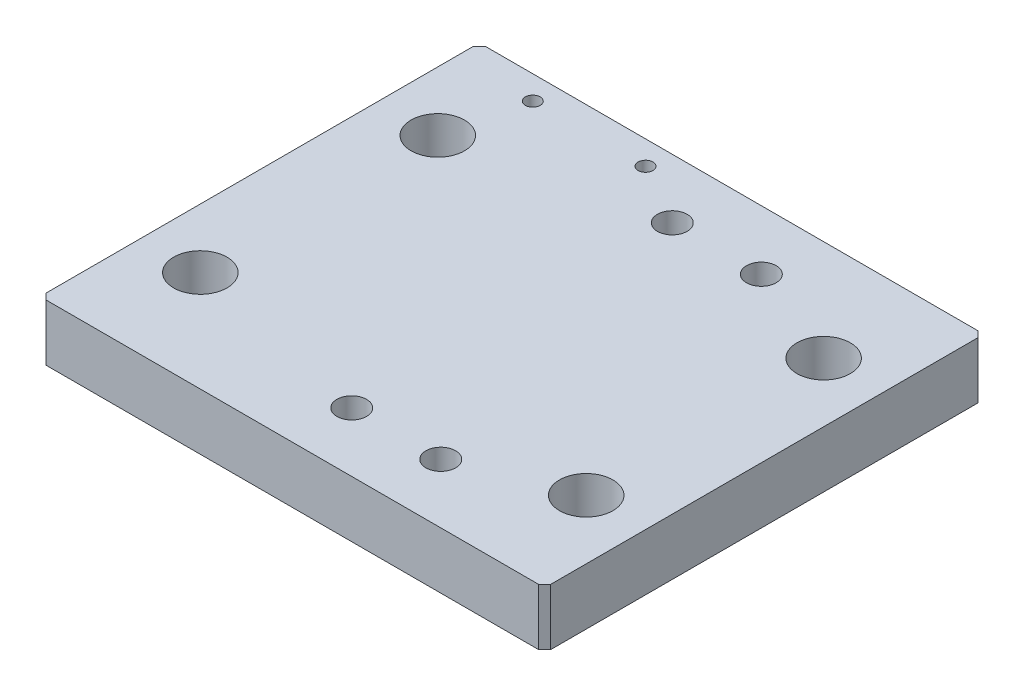
ISO-10303-21;
HEADER;
FILE_DESCRIPTION(('STEP AP214'),'2;1');
FILE_NAME('part.step','',(''),(''),'','','');
FILE_SCHEMA(('AUTOMOTIVE_DESIGN { 1 0 10303 214 1 1 1 1 }'));
ENDSEC;
DATA;
#1=APPLICATION_CONTEXT('core data for automotive mechanical design processes');
#2=APPLICATION_PROTOCOL_DEFINITION('international standard','automotive_design',2000,#1);
#3=PRODUCT_CONTEXT('',#1,'mechanical');
#4=PRODUCT('Part','Part','',(#3));
#5=PRODUCT_RELATED_PRODUCT_CATEGORY('part','',(#4));
#6=PRODUCT_DEFINITION_FORMATION('','',#4);
#7=PRODUCT_DEFINITION_CONTEXT('part definition',#1,'design');
#8=PRODUCT_DEFINITION('design','',#6,#7);
#9=PRODUCT_DEFINITION_SHAPE('','',#8);
#10=(LENGTH_UNIT() NAMED_UNIT(*) SI_UNIT(.MILLI.,.METRE.));
#11=(NAMED_UNIT(*) PLANE_ANGLE_UNIT() SI_UNIT($,.RADIAN.));
#12=(NAMED_UNIT(*) SI_UNIT($,.STERADIAN.) SOLID_ANGLE_UNIT());
#13=UNCERTAINTY_MEASURE_WITH_UNIT(LENGTH_MEASURE(1.E-05),#10,'distance_accuracy_value','');
#14=(GEOMETRIC_REPRESENTATION_CONTEXT(3) GLOBAL_UNCERTAINTY_ASSIGNED_CONTEXT((#13)) GLOBAL_UNIT_ASSIGNED_CONTEXT((#10,
#11,#12)) REPRESENTATION_CONTEXT('',''));
#15=CARTESIAN_POINT('',(0.,0.,0.));
#16=DIRECTION('',(0.,0.,1.));
#17=DIRECTION('',(1.,0.,0.));
#18=AXIS2_PLACEMENT_3D('',#15,#16,#17);
#19=CARTESIAN_POINT('',(42.5,9.525,-37.));
#20=DIRECTION('',(-1.,0.,0.));
#21=DIRECTION('',(0.,0.,1.));
#22=AXIS2_PLACEMENT_3D('',#19,#20,#21);
#23=PLANE('',#22);
#24=DIRECTION('',(0.,0.,-1.));
#25=VECTOR('',#24,1.);
#26=CARTESIAN_POINT('',(42.5,9.525,-37.));
#27=LINE('',#26,#25);
#28=CARTESIAN_POINT('',(42.5,9.525,36.));
#29=VERTEX_POINT('',#28);
#30=CARTESIAN_POINT('',(42.5,9.525,-36.));
#31=VERTEX_POINT('',#30);
#32=EDGE_CURVE('E129',#29,#31,#27,.T.);
#33=ORIENTED_EDGE('',*,*,#32,.F.);
#34=DIRECTION('',(0.,-1.,0.));
#35=VECTOR('',#34,1.);
#36=CARTESIAN_POINT('',(42.5,9.525,36.));
#37=LINE('',#36,#35);
#38=CARTESIAN_POINT('',(42.5,0.,36.));
#39=VERTEX_POINT('',#38);
#40=EDGE_CURVE('E114',#29,#39,#37,.T.);
#41=ORIENTED_EDGE('',*,*,#40,.T.);
#42=DIRECTION('',(0.,0.,-1.));
#43=VECTOR('',#42,1.);
#44=CARTESIAN_POINT('',(42.5,0.,-37.));
#45=LINE('',#44,#43);
#46=CARTESIAN_POINT('',(42.5,0.,-36.));
#47=VERTEX_POINT('',#46);
#48=EDGE_CURVE('E126',#39,#47,#45,.T.);
#49=ORIENTED_EDGE('',*,*,#48,.T.);
#50=DIRECTION('',(0.,1.,0.));
#51=VECTOR('',#50,1.);
#52=CARTESIAN_POINT('',(42.5,9.525,-36.));
#53=LINE('',#52,#51);
#54=EDGE_CURVE('E131',#47,#31,#53,.T.);
#55=ORIENTED_EDGE('',*,*,#54,.T.);
#56=EDGE_LOOP('',(#33,#41,#49,#55));
#57=FACE_BOUND('',#56,.T.);
#58=ADVANCED_FACE('F42',(#57),#23,.F.);
#59=CARTESIAN_POINT('',(-42.5,9.525,-37.));
#60=DIRECTION('',(0.,0.,1.));
#61=DIRECTION('',(1.,0.,0.));
#62=AXIS2_PLACEMENT_3D('',#59,#60,#61);
#63=PLANE('',#62);
#64=DIRECTION('',(-1.,0.,0.));
#65=VECTOR('',#64,1.);
#66=CARTESIAN_POINT('',(-42.5,9.525,-37.));
#67=LINE('',#66,#65);
#68=CARTESIAN_POINT('',(41.5,9.525,-37.));
#69=VERTEX_POINT('',#68);
#70=CARTESIAN_POINT('',(-41.5,9.525,-37.));
#71=VERTEX_POINT('',#70);
#72=EDGE_CURVE('E173',#69,#71,#67,.T.);
#73=ORIENTED_EDGE('',*,*,#72,.F.);
#74=DIRECTION('',(0.,-1.,0.));
#75=VECTOR('',#74,1.);
#76=CARTESIAN_POINT('',(41.5,9.525,-37.));
#77=LINE('',#76,#75);
#78=CARTESIAN_POINT('',(41.5,0.,-37.));
#79=VERTEX_POINT('',#78);
#80=EDGE_CURVE('E11',#69,#79,#77,.T.);
#81=ORIENTED_EDGE('',*,*,#80,.T.);
#82=DIRECTION('',(-1.,0.,0.));
#83=VECTOR('',#82,1.);
#84=CARTESIAN_POINT('',(-42.5,0.,-37.));
#85=LINE('',#84,#83);
#86=CARTESIAN_POINT('',(-41.5,0.,-37.));
#87=VERTEX_POINT('',#86);
#88=EDGE_CURVE('E136',#79,#87,#85,.T.);
#89=ORIENTED_EDGE('',*,*,#88,.T.);
#90=DIRECTION('',(0.,1.,0.));
#91=VECTOR('',#90,1.);
#92=CARTESIAN_POINT('',(-41.5,9.525,-37.));
#93=LINE('',#92,#91);
#94=EDGE_CURVE('E51',#87,#71,#93,.T.);
#95=ORIENTED_EDGE('',*,*,#94,.T.);
#96=EDGE_LOOP('',(#73,#81,#89,#95));
#97=FACE_BOUND('',#96,.T.);
#98=ADVANCED_FACE('F172',(#97),#63,.F.);
#99=CARTESIAN_POINT('',(-42.5,9.525,-37.));
#100=DIRECTION('',(1.,0.,0.));
#101=DIRECTION('',(0.,0.,-1.));
#102=AXIS2_PLACEMENT_3D('',#99,#100,#101);
#103=PLANE('',#102);
#104=DIRECTION('',(0.,0.,1.));
#105=VECTOR('',#104,1.);
#106=CARTESIAN_POINT('',(-42.5,0.,-37.));
#107=LINE('',#106,#105);
#108=CARTESIAN_POINT('',(-42.5,0.,-36.));
#109=VERTEX_POINT('',#108);
#110=CARTESIAN_POINT('',(-42.5,0.,36.));
#111=VERTEX_POINT('',#110);
#112=EDGE_CURVE('E140',#109,#111,#107,.T.);
#113=ORIENTED_EDGE('',*,*,#112,.T.);
#114=DIRECTION('',(0.,1.,0.));
#115=VECTOR('',#114,1.);
#116=CARTESIAN_POINT('',(-42.5,9.525,36.));
#117=LINE('',#116,#115);
#118=CARTESIAN_POINT('',(-42.5,9.525,36.));
#119=VERTEX_POINT('',#118);
#120=EDGE_CURVE('E58',#111,#119,#117,.T.);
#121=ORIENTED_EDGE('',*,*,#120,.T.);
#122=DIRECTION('',(0.,0.,1.));
#123=VECTOR('',#122,1.);
#124=CARTESIAN_POINT('',(-42.5,9.525,-37.));
#125=LINE('',#124,#123);
#126=CARTESIAN_POINT('',(-42.5,9.525,-36.));
#127=VERTEX_POINT('',#126);
#128=EDGE_CURVE('E179',#127,#119,#125,.T.);
#129=ORIENTED_EDGE('',*,*,#128,.F.);
#130=DIRECTION('',(0.,-1.,0.));
#131=VECTOR('',#130,1.);
#132=CARTESIAN_POINT('',(-42.5,9.525,-36.));
#133=LINE('',#132,#131);
#134=EDGE_CURVE('E166',#127,#109,#133,.T.);
#135=ORIENTED_EDGE('',*,*,#134,.T.);
#136=EDGE_LOOP('',(#113,#121,#129,#135));
#137=FACE_BOUND('',#136,.T.);
#138=ADVANCED_FACE('F183',(#137),#103,.F.);
#139=CARTESIAN_POINT('',(-42.5,9.525,37.));
#140=DIRECTION('',(0.,0.,-1.));
#141=DIRECTION('',(-1.,0.,0.));
#142=AXIS2_PLACEMENT_3D('',#139,#140,#141);
#143=PLANE('',#142);
#144=DIRECTION('',(1.,0.,0.));
#145=VECTOR('',#144,1.);
#146=CARTESIAN_POINT('',(-42.5,0.,37.));
#147=LINE('',#146,#145);
#148=CARTESIAN_POINT('',(-41.5,0.,37.));
#149=VERTEX_POINT('',#148);
#150=CARTESIAN_POINT('',(41.5,0.,37.));
#151=VERTEX_POINT('',#150);
#152=EDGE_CURVE('E150',#149,#151,#147,.T.);
#153=ORIENTED_EDGE('',*,*,#152,.T.);
#154=DIRECTION('',(0.,1.,0.));
#155=VECTOR('',#154,1.);
#156=CARTESIAN_POINT('',(41.5,9.525,37.));
#157=LINE('',#156,#155);
#158=CARTESIAN_POINT('',(41.5,9.525,37.));
#159=VERTEX_POINT('',#158);
#160=EDGE_CURVE('E115',#151,#159,#157,.T.);
#161=ORIENTED_EDGE('',*,*,#160,.T.);
#162=DIRECTION('',(1.,0.,0.));
#163=VECTOR('',#162,1.);
#164=CARTESIAN_POINT('',(-42.5,9.525,37.));
#165=LINE('',#164,#163);
#166=CARTESIAN_POINT('',(-41.5,9.525,37.));
#167=VERTEX_POINT('',#166);
#168=EDGE_CURVE('E146',#167,#159,#165,.T.);
#169=ORIENTED_EDGE('',*,*,#168,.F.);
#170=DIRECTION('',(0.,-1.,0.));
#171=VECTOR('',#170,1.);
#172=CARTESIAN_POINT('',(-41.5,9.525,37.));
#173=LINE('',#172,#171);
#174=EDGE_CURVE('E120',#167,#149,#173,.T.);
#175=ORIENTED_EDGE('',*,*,#174,.T.);
#176=EDGE_LOOP('',(#153,#161,#169,#175));
#177=FACE_BOUND('',#176,.T.);
#178=ADVANCED_FACE('F190',(#177),#143,.F.);
#179=CARTESIAN_POINT('',(0.,9.525,0.));
#180=DIRECTION('',(0.,1.,0.));
#181=DIRECTION('',(0.,0.,1.));
#182=AXIS2_PLACEMENT_3D('',#179,#180,#181);
#183=PLANE('',#182);
#184=CARTESIAN_POINT('',(-29.5,9.525,-33.));
#185=DIRECTION('',(0.,1.,0.));
#186=DIRECTION('',(0.,0.,1.));
#187=AXIS2_PLACEMENT_3D('',#184,#185,#186);
#188=CIRCLE('',#187,1.25);
#189=CARTESIAN_POINT('',(-29.5,9.525,-31.75));
#190=VERTEX_POINT('',#189);
#191=EDGE_CURVE('E246',#190,#190,#188,.T.);
#192=ORIENTED_EDGE('',*,*,#191,.F.);
#193=EDGE_LOOP('',(#192));
#194=FACE_BOUND('',#193,.T.);
#195=CARTESIAN_POINT('',(-10.5,9.525,-33.));
#196=DIRECTION('',(0.,1.,0.));
#197=DIRECTION('',(0.,0.,1.));
#198=AXIS2_PLACEMENT_3D('',#195,#196,#197);
#199=CIRCLE('',#198,1.25);
#200=CARTESIAN_POINT('',(-10.5,9.525,-31.75));
#201=VERTEX_POINT('',#200);
#202=EDGE_CURVE('E240',#201,#201,#199,.T.);
#203=ORIENTED_EDGE('',*,*,#202,.F.);
#204=EDGE_LOOP('',(#203));
#205=FACE_BOUND('',#204,.T.);
#206=CARTESIAN_POINT('',(0.,9.525,-27.));
#207=DIRECTION('',(0.,1.,0.));
#208=DIRECTION('',(0.,0.,1.));
#209=AXIS2_PLACEMENT_3D('',#206,#207,#208);
#210=CIRCLE('',#209,2.5);
#211=CARTESIAN_POINT('',(0.,9.525,-24.5));
#212=VERTEX_POINT('',#211);
#213=EDGE_CURVE('E234',#212,#212,#210,.T.);
#214=ORIENTED_EDGE('',*,*,#213,.F.);
#215=EDGE_LOOP('',(#214));
#216=FACE_BOUND('',#215,.T.);
#217=CARTESIAN_POINT('',(15.,9.525,-27.));
#218=DIRECTION('',(0.,1.,0.));
#219=DIRECTION('',(0.,0.,1.));
#220=AXIS2_PLACEMENT_3D('',#217,#218,#219);
#221=CIRCLE('',#220,2.5);
#222=CARTESIAN_POINT('',(15.,9.525,-24.5));
#223=VERTEX_POINT('',#222);
#224=EDGE_CURVE('E228',#223,#223,#221,.T.);
#225=ORIENTED_EDGE('',*,*,#224,.F.);
#226=EDGE_LOOP('',(#225));
#227=FACE_BOUND('',#226,.T.);
#228=CARTESIAN_POINT('',(15.,9.525,27.));
#229=DIRECTION('',(0.,1.,0.));
#230=DIRECTION('',(0.,0.,1.));
#231=AXIS2_PLACEMENT_3D('',#228,#229,#230);
#232=CIRCLE('',#231,2.5);
#233=CARTESIAN_POINT('',(15.,9.525,29.5));
#234=VERTEX_POINT('',#233);
#235=EDGE_CURVE('E222',#234,#234,#232,.T.);
#236=ORIENTED_EDGE('',*,*,#235,.F.);
#237=EDGE_LOOP('',(#236));
#238=FACE_BOUND('',#237,.T.);
#239=CARTESIAN_POINT('',(0.,9.525,27.));
#240=DIRECTION('',(0.,1.,0.));
#241=DIRECTION('',(0.,0.,1.));
#242=AXIS2_PLACEMENT_3D('',#239,#240,#241);
#243=CIRCLE('',#242,2.5);
#244=CARTESIAN_POINT('',(0.,9.525,29.5));
#245=VERTEX_POINT('',#244);
#246=EDGE_CURVE('E216',#245,#245,#243,.T.);
#247=ORIENTED_EDGE('',*,*,#246,.F.);
#248=EDGE_LOOP('',(#247));
#249=FACE_BOUND('',#248,.T.);
#250=CARTESIAN_POINT('',(-32.5,9.525,-20.));
#251=DIRECTION('',(0.,1.,0.));
#252=DIRECTION('',(0.,0.,1.));
#253=AXIS2_PLACEMENT_3D('',#250,#251,#252);
#254=CIRCLE('',#253,4.5);
#255=CARTESIAN_POINT('',(-32.5,9.525,-15.5));
#256=VERTEX_POINT('',#255);
#257=EDGE_CURVE('E210',#256,#256,#254,.T.);
#258=ORIENTED_EDGE('',*,*,#257,.F.);
#259=EDGE_LOOP('',(#258));
#260=FACE_BOUND('',#259,.T.);
#261=CARTESIAN_POINT('',(32.5,9.525,-20.));
#262=DIRECTION('',(0.,1.,0.));
#263=DIRECTION('',(0.,0.,1.));
#264=AXIS2_PLACEMENT_3D('',#261,#262,#263);
#265=CIRCLE('',#264,4.5);
#266=CARTESIAN_POINT('',(32.5,9.525,-15.5));
#267=VERTEX_POINT('',#266);
#268=EDGE_CURVE('E204',#267,#267,#265,.T.);
#269=ORIENTED_EDGE('',*,*,#268,.F.);
#270=EDGE_LOOP('',(#269));
#271=FACE_BOUND('',#270,.T.);
#272=CARTESIAN_POINT('',(32.5,9.525,20.));
#273=DIRECTION('',(0.,1.,0.));
#274=DIRECTION('',(0.,0.,1.));
#275=AXIS2_PLACEMENT_3D('',#272,#273,#274);
#276=CIRCLE('',#275,4.5);
#277=CARTESIAN_POINT('',(32.5,9.525,24.5));
#278=VERTEX_POINT('',#277);
#279=EDGE_CURVE('E198',#278,#278,#276,.T.);
#280=ORIENTED_EDGE('',*,*,#279,.F.);
#281=EDGE_LOOP('',(#280));
#282=FACE_BOUND('',#281,.T.);
#283=CARTESIAN_POINT('',(-32.5,9.525,20.));
#284=DIRECTION('',(0.,1.,0.));
#285=DIRECTION('',(0.,0.,1.));
#286=AXIS2_PLACEMENT_3D('',#283,#284,#285);
#287=CIRCLE('',#286,4.5);
#288=CARTESIAN_POINT('',(-32.5,9.525,24.5));
#289=VERTEX_POINT('',#288);
#290=EDGE_CURVE('E143',#289,#289,#287,.T.);
#291=ORIENTED_EDGE('',*,*,#290,.F.);
#292=EDGE_LOOP('',(#291));
#293=FACE_BOUND('',#292,.T.);
#294=ORIENTED_EDGE('',*,*,#168,.T.);
#295=DIRECTION('',(-0.707106781186557,0.,0.707106781186538));
#296=VECTOR('',#295,1.);
#297=CARTESIAN_POINT('',(39.2499999999994,9.525,39.2500000000005));
#298=LINE('',#297,#296);
#299=EDGE_CURVE('E164',#159,#29,#298,.F.);
#300=ORIENTED_EDGE('',*,*,#299,.T.);
#301=ORIENTED_EDGE('',*,*,#32,.T.);
#302=DIRECTION('',(0.707106781186545,0.,0.70710678118655));
#303=VECTOR('',#302,1.);
#304=CARTESIAN_POINT('',(39.2500000000001,9.525,-39.2499999999999));
#305=LINE('',#304,#303);
#306=EDGE_CURVE('E160',#31,#69,#305,.F.);
#307=ORIENTED_EDGE('',*,*,#306,.T.);
#308=ORIENTED_EDGE('',*,*,#72,.T.);
#309=DIRECTION('',(0.707106781186552,0.,-0.707106781186543));
#310=VECTOR('',#309,1.);
#311=CARTESIAN_POINT('',(-39.2499999999997,9.525,-39.2500000000002));
#312=LINE('',#311,#310);
#313=EDGE_CURVE('E65',#71,#127,#312,.F.);
#314=ORIENTED_EDGE('',*,*,#313,.T.);
#315=ORIENTED_EDGE('',*,*,#128,.T.);
#316=DIRECTION('',(-0.70710678118654,0.,-0.707106781186555));
#317=VECTOR('',#316,1.);
#318=CARTESIAN_POINT('',(-39.2500000000004,9.525,39.2499999999996));
#319=LINE('',#318,#317);
#320=EDGE_CURVE('E162',#119,#167,#319,.F.);
#321=ORIENTED_EDGE('',*,*,#320,.T.);
#322=EDGE_LOOP('',(#294,#300,#301,#307,#308,#314,#315,#321));
#323=FACE_BOUND('',#322,.T.);
#324=ADVANCED_FACE('F177',(#194,#205,#216,#227,#238,#249,#260,#271,#282,#293,#323),#183,.T.);
#325=CARTESIAN_POINT('',(0.,0.,0.));
#326=DIRECTION('',(0.,1.,0.));
#327=DIRECTION('',(0.,0.,1.));
#328=AXIS2_PLACEMENT_3D('',#325,#326,#327);
#329=PLANE('',#328);
#330=CARTESIAN_POINT('',(-29.5,0.,-33.));
#331=DIRECTION('',(0.,1.,0.));
#332=DIRECTION('',(0.,0.,1.));
#333=AXIS2_PLACEMENT_3D('',#330,#331,#332);
#334=CIRCLE('',#333,1.25);
#335=CARTESIAN_POINT('',(-29.5,0.,-31.75));
#336=VERTEX_POINT('',#335);
#337=EDGE_CURVE('E243',#336,#336,#334,.T.);
#338=ORIENTED_EDGE('',*,*,#337,.T.);
#339=EDGE_LOOP('',(#338));
#340=FACE_BOUND('',#339,.T.);
#341=CARTESIAN_POINT('',(-10.5,0.,-33.));
#342=DIRECTION('',(0.,1.,0.));
#343=DIRECTION('',(0.,0.,1.));
#344=AXIS2_PLACEMENT_3D('',#341,#342,#343);
#345=CIRCLE('',#344,1.25);
#346=CARTESIAN_POINT('',(-10.5,0.,-31.75));
#347=VERTEX_POINT('',#346);
#348=EDGE_CURVE('E237',#347,#347,#345,.T.);
#349=ORIENTED_EDGE('',*,*,#348,.T.);
#350=EDGE_LOOP('',(#349));
#351=FACE_BOUND('',#350,.T.);
#352=CARTESIAN_POINT('',(0.,0.,-27.));
#353=DIRECTION('',(0.,1.,0.));
#354=DIRECTION('',(0.,0.,1.));
#355=AXIS2_PLACEMENT_3D('',#352,#353,#354);
#356=CIRCLE('',#355,2.5);
#357=CARTESIAN_POINT('',(0.,0.,-24.5));
#358=VERTEX_POINT('',#357);
#359=EDGE_CURVE('E231',#358,#358,#356,.T.);
#360=ORIENTED_EDGE('',*,*,#359,.T.);
#361=EDGE_LOOP('',(#360));
#362=FACE_BOUND('',#361,.T.);
#363=CARTESIAN_POINT('',(15.,0.,-27.));
#364=DIRECTION('',(0.,1.,0.));
#365=DIRECTION('',(0.,0.,1.));
#366=AXIS2_PLACEMENT_3D('',#363,#364,#365);
#367=CIRCLE('',#366,2.5);
#368=CARTESIAN_POINT('',(15.,0.,-24.5));
#369=VERTEX_POINT('',#368);
#370=EDGE_CURVE('E225',#369,#369,#367,.T.);
#371=ORIENTED_EDGE('',*,*,#370,.T.);
#372=EDGE_LOOP('',(#371));
#373=FACE_BOUND('',#372,.T.);
#374=CARTESIAN_POINT('',(15.,0.,27.));
#375=DIRECTION('',(0.,1.,0.));
#376=DIRECTION('',(0.,0.,1.));
#377=AXIS2_PLACEMENT_3D('',#374,#375,#376);
#378=CIRCLE('',#377,2.5);
#379=CARTESIAN_POINT('',(15.,0.,29.5));
#380=VERTEX_POINT('',#379);
#381=EDGE_CURVE('E219',#380,#380,#378,.T.);
#382=ORIENTED_EDGE('',*,*,#381,.T.);
#383=EDGE_LOOP('',(#382));
#384=FACE_BOUND('',#383,.T.);
#385=CARTESIAN_POINT('',(0.,0.,27.));
#386=DIRECTION('',(0.,1.,0.));
#387=DIRECTION('',(0.,0.,1.));
#388=AXIS2_PLACEMENT_3D('',#385,#386,#387);
#389=CIRCLE('',#388,2.5);
#390=CARTESIAN_POINT('',(0.,0.,29.5));
#391=VERTEX_POINT('',#390);
#392=EDGE_CURVE('E213',#391,#391,#389,.T.);
#393=ORIENTED_EDGE('',*,*,#392,.T.);
#394=EDGE_LOOP('',(#393));
#395=FACE_BOUND('',#394,.T.);
#396=CARTESIAN_POINT('',(-32.5,0.,-20.));
#397=DIRECTION('',(0.,1.,0.));
#398=DIRECTION('',(0.,0.,1.));
#399=AXIS2_PLACEMENT_3D('',#396,#397,#398);
#400=CIRCLE('',#399,4.5);
#401=CARTESIAN_POINT('',(-32.5,0.,-15.5));
#402=VERTEX_POINT('',#401);
#403=EDGE_CURVE('E207',#402,#402,#400,.T.);
#404=ORIENTED_EDGE('',*,*,#403,.T.);
#405=EDGE_LOOP('',(#404));
#406=FACE_BOUND('',#405,.T.);
#407=CARTESIAN_POINT('',(32.5,0.,-20.));
#408=DIRECTION('',(0.,1.,0.));
#409=DIRECTION('',(0.,0.,1.));
#410=AXIS2_PLACEMENT_3D('',#407,#408,#409);
#411=CIRCLE('',#410,4.5);
#412=CARTESIAN_POINT('',(32.5,0.,-15.5));
#413=VERTEX_POINT('',#412);
#414=EDGE_CURVE('E201',#413,#413,#411,.T.);
#415=ORIENTED_EDGE('',*,*,#414,.T.);
#416=EDGE_LOOP('',(#415));
#417=FACE_BOUND('',#416,.T.);
#418=CARTESIAN_POINT('',(32.5,0.,20.));
#419=DIRECTION('',(0.,1.,0.));
#420=DIRECTION('',(0.,0.,1.));
#421=AXIS2_PLACEMENT_3D('',#418,#419,#420);
#422=CIRCLE('',#421,4.5);
#423=CARTESIAN_POINT('',(32.5,0.,24.5));
#424=VERTEX_POINT('',#423);
#425=EDGE_CURVE('E195',#424,#424,#422,.T.);
#426=ORIENTED_EDGE('',*,*,#425,.T.);
#427=EDGE_LOOP('',(#426));
#428=FACE_BOUND('',#427,.T.);
#429=CARTESIAN_POINT('',(-32.5,0.,20.));
#430=DIRECTION('',(0.,1.,0.));
#431=DIRECTION('',(0.,0.,1.));
#432=AXIS2_PLACEMENT_3D('',#429,#430,#431);
#433=CIRCLE('',#432,4.5);
#434=CARTESIAN_POINT('',(-32.5,0.,24.5));
#435=VERTEX_POINT('',#434);
#436=EDGE_CURVE('E137',#435,#435,#433,.T.);
#437=ORIENTED_EDGE('',*,*,#436,.T.);
#438=EDGE_LOOP('',(#437));
#439=FACE_BOUND('',#438,.T.);
#440=ORIENTED_EDGE('',*,*,#48,.F.);
#441=DIRECTION('',(0.707106781186557,0.,-0.707106781186538));
#442=VECTOR('',#441,1.);
#443=CARTESIAN_POINT('',(42.5,0.,36.));
#444=LINE('',#443,#442);
#445=EDGE_CURVE('E110',#39,#151,#444,.F.);
#446=ORIENTED_EDGE('',*,*,#445,.T.);
#447=ORIENTED_EDGE('',*,*,#152,.F.);
#448=DIRECTION('',(0.70710678118654,0.,0.707106781186555));
#449=VECTOR('',#448,1.);
#450=CARTESIAN_POINT('',(-41.5,0.,37.));
#451=LINE('',#450,#449);
#452=EDGE_CURVE('E121',#149,#111,#451,.F.);
#453=ORIENTED_EDGE('',*,*,#452,.T.);
#454=ORIENTED_EDGE('',*,*,#112,.F.);
#455=DIRECTION('',(-0.707106781186552,0.,0.707106781186543));
#456=VECTOR('',#455,1.);
#457=CARTESIAN_POINT('',(-42.5,0.,-36.));
#458=LINE('',#457,#456);
#459=EDGE_CURVE('E130',#109,#87,#458,.F.);
#460=ORIENTED_EDGE('',*,*,#459,.T.);
#461=ORIENTED_EDGE('',*,*,#88,.F.);
#462=DIRECTION('',(-0.707106781186545,0.,-0.70710678118655));
#463=VECTOR('',#462,1.);
#464=CARTESIAN_POINT('',(41.5,0.,-37.));
#465=LINE('',#464,#463);
#466=EDGE_CURVE('E135',#79,#47,#465,.F.);
#467=ORIENTED_EDGE('',*,*,#466,.T.);
#468=EDGE_LOOP('',(#440,#446,#447,#453,#454,#460,#461,#467));
#469=FACE_BOUND('',#468,.T.);
#470=ADVANCED_FACE('F133',(#340,#351,#362,#373,#384,#395,#406,#417,#428,#439,#469),#329,.F.);
#471=CARTESIAN_POINT('',(-32.5,9.525,20.));
#472=DIRECTION('',(0.,1.,0.));
#473=DIRECTION('',(0.,0.,1.));
#474=AXIS2_PLACEMENT_3D('',#471,#472,#473);
#475=CYLINDRICAL_SURFACE('',#474,4.5);
#476=ORIENTED_EDGE('',*,*,#436,.F.);
#477=EDGE_LOOP('',(#476));
#478=FACE_BOUND('',#477,.T.);
#479=ORIENTED_EDGE('',*,*,#290,.T.);
#480=EDGE_LOOP('',(#479));
#481=FACE_BOUND('',#480,.T.);
#482=ADVANCED_FACE('F273',(#478,#481),#475,.F.);
#483=CARTESIAN_POINT('',(32.5,9.525,20.));
#484=DIRECTION('',(0.,1.,0.));
#485=DIRECTION('',(0.,0.,1.));
#486=AXIS2_PLACEMENT_3D('',#483,#484,#485);
#487=CYLINDRICAL_SURFACE('',#486,4.5);
#488=ORIENTED_EDGE('',*,*,#425,.F.);
#489=EDGE_LOOP('',(#488));
#490=FACE_BOUND('',#489,.T.);
#491=ORIENTED_EDGE('',*,*,#279,.T.);
#492=EDGE_LOOP('',(#491));
#493=FACE_BOUND('',#492,.T.);
#494=ADVANCED_FACE('F275',(#490,#493),#487,.F.);
#495=CARTESIAN_POINT('',(32.5,9.525,-20.));
#496=DIRECTION('',(0.,1.,0.));
#497=DIRECTION('',(0.,0.,1.));
#498=AXIS2_PLACEMENT_3D('',#495,#496,#497);
#499=CYLINDRICAL_SURFACE('',#498,4.5);
#500=ORIENTED_EDGE('',*,*,#414,.F.);
#501=EDGE_LOOP('',(#500));
#502=FACE_BOUND('',#501,.T.);
#503=ORIENTED_EDGE('',*,*,#268,.T.);
#504=EDGE_LOOP('',(#503));
#505=FACE_BOUND('',#504,.T.);
#506=ADVANCED_FACE('F282',(#502,#505),#499,.F.);
#507=CARTESIAN_POINT('',(-32.5,9.525,-20.));
#508=DIRECTION('',(0.,1.,0.));
#509=DIRECTION('',(0.,0.,1.));
#510=AXIS2_PLACEMENT_3D('',#507,#508,#509);
#511=CYLINDRICAL_SURFACE('',#510,4.5);
#512=ORIENTED_EDGE('',*,*,#403,.F.);
#513=EDGE_LOOP('',(#512));
#514=FACE_BOUND('',#513,.T.);
#515=ORIENTED_EDGE('',*,*,#257,.T.);
#516=EDGE_LOOP('',(#515));
#517=FACE_BOUND('',#516,.T.);
#518=ADVANCED_FACE('F442',(#514,#517),#511,.F.);
#519=CARTESIAN_POINT('',(0.,9.525,27.));
#520=DIRECTION('',(0.,1.,0.));
#521=DIRECTION('',(0.,0.,1.));
#522=AXIS2_PLACEMENT_3D('',#519,#520,#521);
#523=CYLINDRICAL_SURFACE('',#522,2.5);
#524=ORIENTED_EDGE('',*,*,#392,.F.);
#525=EDGE_LOOP('',(#524));
#526=FACE_BOUND('',#525,.T.);
#527=ORIENTED_EDGE('',*,*,#246,.T.);
#528=EDGE_LOOP('',(#527));
#529=FACE_BOUND('',#528,.T.);
#530=ADVANCED_FACE('F430',(#526,#529),#523,.F.);
#531=CARTESIAN_POINT('',(15.,9.525,27.));
#532=DIRECTION('',(0.,1.,0.));
#533=DIRECTION('',(0.,0.,1.));
#534=AXIS2_PLACEMENT_3D('',#531,#532,#533);
#535=CYLINDRICAL_SURFACE('',#534,2.5);
#536=ORIENTED_EDGE('',*,*,#381,.F.);
#537=EDGE_LOOP('',(#536));
#538=FACE_BOUND('',#537,.T.);
#539=ORIENTED_EDGE('',*,*,#235,.T.);
#540=EDGE_LOOP('',(#539));
#541=FACE_BOUND('',#540,.T.);
#542=ADVANCED_FACE('F418',(#538,#541),#535,.F.);
#543=CARTESIAN_POINT('',(15.,9.525,-27.));
#544=DIRECTION('',(0.,1.,0.));
#545=DIRECTION('',(0.,0.,1.));
#546=AXIS2_PLACEMENT_3D('',#543,#544,#545);
#547=CYLINDRICAL_SURFACE('',#546,2.5);
#548=ORIENTED_EDGE('',*,*,#370,.F.);
#549=EDGE_LOOP('',(#548));
#550=FACE_BOUND('',#549,.T.);
#551=ORIENTED_EDGE('',*,*,#224,.T.);
#552=EDGE_LOOP('',(#551));
#553=FACE_BOUND('',#552,.T.);
#554=ADVANCED_FACE('F406',(#550,#553),#547,.F.);
#555=CARTESIAN_POINT('',(0.,9.525,-27.));
#556=DIRECTION('',(0.,1.,0.));
#557=DIRECTION('',(0.,0.,1.));
#558=AXIS2_PLACEMENT_3D('',#555,#556,#557);
#559=CYLINDRICAL_SURFACE('',#558,2.5);
#560=ORIENTED_EDGE('',*,*,#359,.F.);
#561=EDGE_LOOP('',(#560));
#562=FACE_BOUND('',#561,.T.);
#563=ORIENTED_EDGE('',*,*,#213,.T.);
#564=EDGE_LOOP('',(#563));
#565=FACE_BOUND('',#564,.T.);
#566=ADVANCED_FACE('F394',(#562,#565),#559,.F.);
#567=CARTESIAN_POINT('',(-10.5,9.525,-33.));
#568=DIRECTION('',(0.,1.,0.));
#569=DIRECTION('',(0.,0.,1.));
#570=AXIS2_PLACEMENT_3D('',#567,#568,#569);
#571=CYLINDRICAL_SURFACE('',#570,1.25);
#572=ORIENTED_EDGE('',*,*,#348,.F.);
#573=EDGE_LOOP('',(#572));
#574=FACE_BOUND('',#573,.T.);
#575=ORIENTED_EDGE('',*,*,#202,.T.);
#576=EDGE_LOOP('',(#575));
#577=FACE_BOUND('',#576,.T.);
#578=ADVANCED_FACE('F383',(#574,#577),#571,.F.);
#579=CARTESIAN_POINT('',(-29.5,9.525,-33.));
#580=DIRECTION('',(0.,1.,0.));
#581=DIRECTION('',(0.,0.,1.));
#582=AXIS2_PLACEMENT_3D('',#579,#580,#581);
#583=CYLINDRICAL_SURFACE('',#582,1.25);
#584=ORIENTED_EDGE('',*,*,#337,.F.);
#585=EDGE_LOOP('',(#584));
#586=FACE_BOUND('',#585,.T.);
#587=ORIENTED_EDGE('',*,*,#191,.T.);
#588=EDGE_LOOP('',(#587));
#589=FACE_BOUND('',#588,.T.);
#590=ADVANCED_FACE('F250',(#586,#589),#583,.F.);
#591=CARTESIAN_POINT('',(42.5,9.525,36.));
#592=DIRECTION('',(-0.707106781186538,0.,-0.707106781186557));
#593=DIRECTION('',(0.,-1.,0.));
#594=AXIS2_PLACEMENT_3D('',#591,#592,#593);
#595=PLANE('',#594);
#596=ORIENTED_EDGE('',*,*,#299,.F.);
#597=ORIENTED_EDGE('',*,*,#160,.F.);
#598=ORIENTED_EDGE('',*,*,#445,.F.);
#599=ORIENTED_EDGE('',*,*,#40,.F.);
#600=EDGE_LOOP('',(#596,#597,#598,#599));
#601=FACE_BOUND('',#600,.T.);
#602=ADVANCED_FACE('F113',(#601),#595,.F.);
#603=CARTESIAN_POINT('',(-41.5,9.525,37.));
#604=DIRECTION('',(0.707106781186555,0.,-0.70710678118654));
#605=DIRECTION('',(0.,-1.,0.));
#606=AXIS2_PLACEMENT_3D('',#603,#604,#605);
#607=PLANE('',#606);
#608=ORIENTED_EDGE('',*,*,#320,.F.);
#609=ORIENTED_EDGE('',*,*,#120,.F.);
#610=ORIENTED_EDGE('',*,*,#452,.F.);
#611=ORIENTED_EDGE('',*,*,#174,.F.);
#612=EDGE_LOOP('',(#608,#609,#610,#611));
#613=FACE_BOUND('',#612,.T.);
#614=ADVANCED_FACE('F187',(#613),#607,.F.);
#615=CARTESIAN_POINT('',(41.5,9.525,-37.));
#616=DIRECTION('',(-0.70710678118655,0.,0.707106781186545));
#617=DIRECTION('',(0.,-1.,0.));
#618=AXIS2_PLACEMENT_3D('',#615,#616,#617);
#619=PLANE('',#618);
#620=ORIENTED_EDGE('',*,*,#306,.F.);
#621=ORIENTED_EDGE('',*,*,#54,.F.);
#622=ORIENTED_EDGE('',*,*,#466,.F.);
#623=ORIENTED_EDGE('',*,*,#80,.F.);
#624=EDGE_LOOP('',(#620,#621,#622,#623));
#625=FACE_BOUND('',#624,.T.);
#626=ADVANCED_FACE('F306',(#625),#619,.F.);
#627=CARTESIAN_POINT('',(-42.5,9.525,-36.));
#628=DIRECTION('',(0.707106781186542,0.,0.707106781186552));
#629=DIRECTION('',(0.,-1.,0.));
#630=AXIS2_PLACEMENT_3D('',#627,#628,#629);
#631=PLANE('',#630);
#632=ORIENTED_EDGE('',*,*,#313,.F.);
#633=ORIENTED_EDGE('',*,*,#94,.F.);
#634=ORIENTED_EDGE('',*,*,#459,.F.);
#635=ORIENTED_EDGE('',*,*,#134,.F.);
#636=EDGE_LOOP('',(#632,#633,#634,#635));
#637=FACE_BOUND('',#636,.T.);
#638=ADVANCED_FACE('F45',(#637),#631,.F.);
#639=CLOSED_SHELL('',(#58,#98,#138,#178,#324,#470,#482,#494,#506,#518,#530,#542,#554,#566,#578,
#590,#602,#614,#626,#638));
#640=MANIFOLD_SOLID_BREP('B2',#639);
#641=ADVANCED_BREP_SHAPE_REPRESENTATION('',(#18,#640),#14);
#642=SHAPE_DEFINITION_REPRESENTATION(#9,#641);
ENDSEC;
END-ISO-10303-21;
